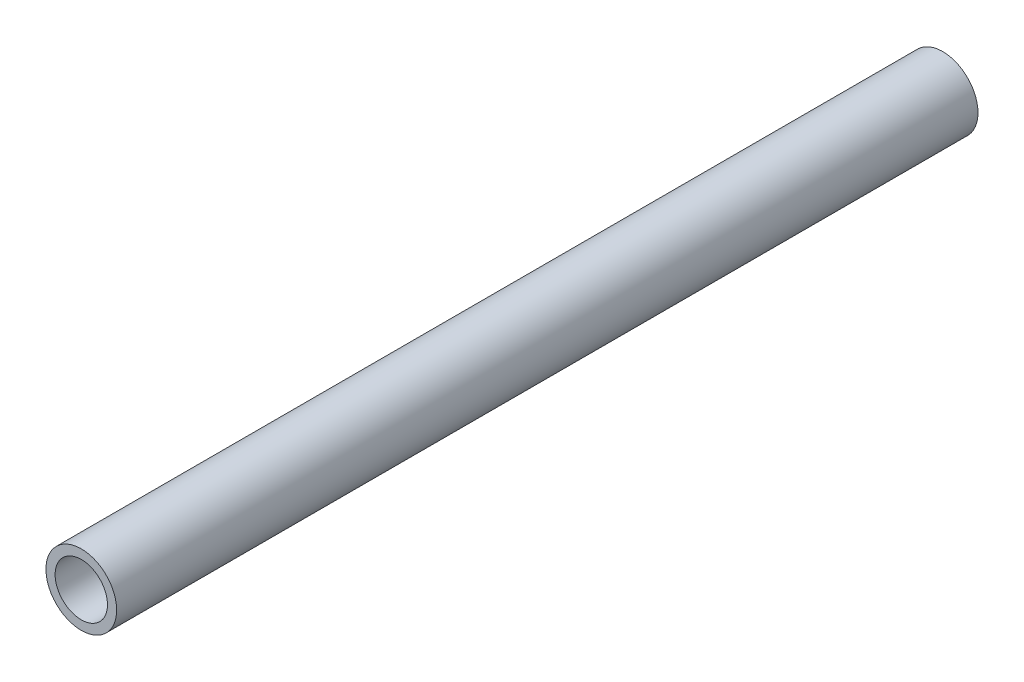
ISO-10303-21;
HEADER;
FILE_DESCRIPTION(('STEP AP214'),'2;1');
FILE_NAME('part.step','',(''),(''),'','','');
FILE_SCHEMA(('AUTOMOTIVE_DESIGN { 1 0 10303 214 1 1 1 1 }'));
ENDSEC;
DATA;
#1=APPLICATION_CONTEXT('core data for automotive mechanical design processes');
#2=APPLICATION_PROTOCOL_DEFINITION('international standard','automotive_design',2000,#1);
#3=PRODUCT_CONTEXT('',#1,'mechanical');
#4=PRODUCT('Part','Part','',(#3));
#5=PRODUCT_RELATED_PRODUCT_CATEGORY('part','',(#4));
#6=PRODUCT_DEFINITION_FORMATION('','',#4);
#7=PRODUCT_DEFINITION_CONTEXT('part definition',#1,'design');
#8=PRODUCT_DEFINITION('design','',#6,#7);
#9=PRODUCT_DEFINITION_SHAPE('','',#8);
#10=(LENGTH_UNIT() NAMED_UNIT(*) SI_UNIT(.MILLI.,.METRE.));
#11=(NAMED_UNIT(*) PLANE_ANGLE_UNIT() SI_UNIT($,.RADIAN.));
#12=(NAMED_UNIT(*) SI_UNIT($,.STERADIAN.) SOLID_ANGLE_UNIT());
#13=UNCERTAINTY_MEASURE_WITH_UNIT(LENGTH_MEASURE(1.E-05),#10,'distance_accuracy_value','');
#14=(GEOMETRIC_REPRESENTATION_CONTEXT(3) GLOBAL_UNCERTAINTY_ASSIGNED_CONTEXT((#13)) GLOBAL_UNIT_ASSIGNED_CONTEXT((#10,
#11,#12)) REPRESENTATION_CONTEXT('',''));
#15=CARTESIAN_POINT('',(0.,0.,0.));
#16=DIRECTION('',(0.,0.,1.));
#17=DIRECTION('',(1.,0.,0.));
#18=AXIS2_PLACEMENT_3D('',#15,#16,#17);
#19=CARTESIAN_POINT('',(0.,0.,130.));
#20=DIRECTION('',(0.,0.,1.));
#21=DIRECTION('',(1.,0.,0.));
#22=AXIS2_PLACEMENT_3D('',#19,#20,#21);
#23=PLANE('',#22);
#24=CARTESIAN_POINT('',(0.,0.,130.));
#25=DIRECTION('',(0.,0.,1.));
#26=DIRECTION('',(1.,0.,0.));
#27=AXIS2_PLACEMENT_3D('',#24,#25,#26);
#28=CIRCLE('',#27,10.668);
#29=CARTESIAN_POINT('',(10.668,0.,130.));
#30=VERTEX_POINT('',#29);
#31=EDGE_CURVE('E11',#30,#30,#28,.T.);
#32=ORIENTED_EDGE('',*,*,#31,.T.);
#33=EDGE_LOOP('',(#32));
#34=FACE_BOUND('',#33,.T.);
#35=CARTESIAN_POINT('',(0.,0.,130.));
#36=DIRECTION('',(0.,0.,1.));
#37=DIRECTION('',(1.,0.,0.));
#38=AXIS2_PLACEMENT_3D('',#35,#36,#37);
#39=CIRCLE('',#38,7.8994);
#40=CARTESIAN_POINT('',(7.8994,0.,130.));
#41=VERTEX_POINT('',#40);
#42=EDGE_CURVE('E50',#41,#41,#39,.T.);
#43=ORIENTED_EDGE('',*,*,#42,.F.);
#44=EDGE_LOOP('',(#43));
#45=FACE_BOUND('',#44,.T.);
#46=ADVANCED_FACE('F39',(#34,#45),#23,.T.);
#47=CARTESIAN_POINT('',(0.,0.,-130.));
#48=DIRECTION('',(0.,0.,1.));
#49=DIRECTION('',(1.,0.,0.));
#50=AXIS2_PLACEMENT_3D('',#47,#48,#49);
#51=PLANE('',#50);
#52=CARTESIAN_POINT('',(0.,0.,-130.));
#53=DIRECTION('',(0.,0.,1.));
#54=DIRECTION('',(1.,0.,0.));
#55=AXIS2_PLACEMENT_3D('',#52,#53,#54);
#56=CIRCLE('',#55,10.668);
#57=CARTESIAN_POINT('',(10.668,0.,-130.));
#58=VERTEX_POINT('',#57);
#59=EDGE_CURVE('E43',#58,#58,#56,.T.);
#60=ORIENTED_EDGE('',*,*,#59,.F.);
#61=EDGE_LOOP('',(#60));
#62=FACE_BOUND('',#61,.T.);
#63=CARTESIAN_POINT('',(0.,0.,-130.));
#64=DIRECTION('',(0.,0.,1.));
#65=DIRECTION('',(1.,0.,0.));
#66=AXIS2_PLACEMENT_3D('',#63,#64,#65);
#67=CIRCLE('',#66,7.8994);
#68=CARTESIAN_POINT('',(7.8994,0.,-130.));
#69=VERTEX_POINT('',#68);
#70=EDGE_CURVE('E52',#69,#69,#67,.T.);
#71=ORIENTED_EDGE('',*,*,#70,.T.);
#72=EDGE_LOOP('',(#71));
#73=FACE_BOUND('',#72,.T.);
#74=ADVANCED_FACE('F62',(#62,#73),#51,.F.);
#75=CARTESIAN_POINT('',(0.,0.,130.));
#76=DIRECTION('',(0.,0.,-1.));
#77=DIRECTION('',(-1.,0.,0.));
#78=AXIS2_PLACEMENT_3D('',#75,#76,#77);
#79=CYLINDRICAL_SURFACE('',#78,10.668);
#80=ORIENTED_EDGE('',*,*,#31,.F.);
#81=EDGE_LOOP('',(#80));
#82=FACE_BOUND('',#81,.T.);
#83=ORIENTED_EDGE('',*,*,#59,.T.);
#84=EDGE_LOOP('',(#83));
#85=FACE_BOUND('',#84,.T.);
#86=ADVANCED_FACE('F41',(#82,#85),#79,.T.);
#87=CARTESIAN_POINT('',(0.,0.,130.));
#88=DIRECTION('',(0.,0.,-1.));
#89=DIRECTION('',(-1.,0.,0.));
#90=AXIS2_PLACEMENT_3D('',#87,#88,#89);
#91=CYLINDRICAL_SURFACE('',#90,7.8994);
#92=ORIENTED_EDGE('',*,*,#42,.T.);
#93=EDGE_LOOP('',(#92));
#94=FACE_BOUND('',#93,.T.);
#95=ORIENTED_EDGE('',*,*,#70,.F.);
#96=EDGE_LOOP('',(#95));
#97=FACE_BOUND('',#96,.T.);
#98=ADVANCED_FACE('F58',(#94,#97),#91,.F.);
#99=CLOSED_SHELL('',(#46,#74,#86,#98));
#100=MANIFOLD_SOLID_BREP('B2',#99);
#101=ADVANCED_BREP_SHAPE_REPRESENTATION('',(#18,#100),#14);
#102=SHAPE_DEFINITION_REPRESENTATION(#9,#101);
ENDSEC;
END-ISO-10303-21;
